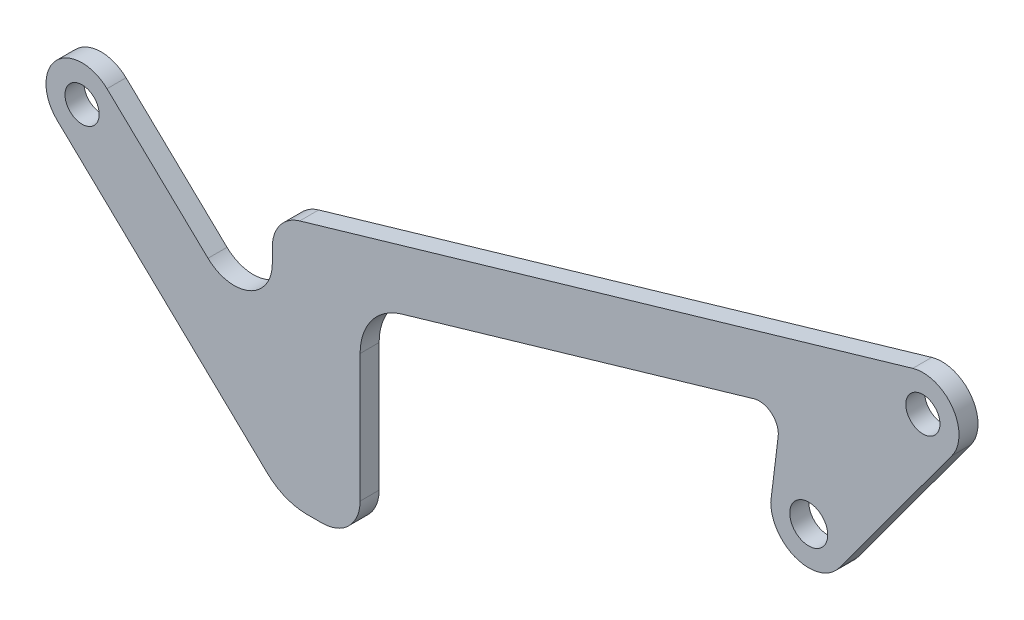
ISO-10303-21;
HEADER;
FILE_DESCRIPTION(('STEP AP214'),'2;1');
FILE_NAME('part.step','',(''),(''),'','','');
FILE_SCHEMA(('AUTOMOTIVE_DESIGN { 1 0 10303 214 1 1 1 1 }'));
ENDSEC;
DATA;
#1=APPLICATION_CONTEXT('core data for automotive mechanical design processes');
#2=APPLICATION_PROTOCOL_DEFINITION('international standard','automotive_design',2000,#1);
#3=PRODUCT_CONTEXT('',#1,'mechanical');
#4=PRODUCT('Part','Part','',(#3));
#5=PRODUCT_RELATED_PRODUCT_CATEGORY('part','',(#4));
#6=PRODUCT_DEFINITION_FORMATION('','',#4);
#7=PRODUCT_DEFINITION_CONTEXT('part definition',#1,'design');
#8=PRODUCT_DEFINITION('design','',#6,#7);
#9=PRODUCT_DEFINITION_SHAPE('','',#8);
#10=(LENGTH_UNIT() NAMED_UNIT(*) SI_UNIT(.MILLI.,.METRE.));
#11=(NAMED_UNIT(*) PLANE_ANGLE_UNIT() SI_UNIT($,.RADIAN.));
#12=(NAMED_UNIT(*) SI_UNIT($,.STERADIAN.) SOLID_ANGLE_UNIT());
#13=UNCERTAINTY_MEASURE_WITH_UNIT(LENGTH_MEASURE(1.E-05),#10,'distance_accuracy_value','');
#14=(GEOMETRIC_REPRESENTATION_CONTEXT(3) GLOBAL_UNCERTAINTY_ASSIGNED_CONTEXT((#13)) GLOBAL_UNIT_ASSIGNED_CONTEXT((#10,
#11,#12)) REPRESENTATION_CONTEXT('',''));
#15=CARTESIAN_POINT('',(0.,0.,0.));
#16=DIRECTION('',(0.,0.,1.));
#17=DIRECTION('',(1.,0.,0.));
#18=AXIS2_PLACEMENT_3D('',#15,#16,#17);
#19=CARTESIAN_POINT('',(-151.,-11.2228576199505,5.));
#20=DIRECTION('',(0.,0.,-1.));
#21=DIRECTION('',(-1.,0.,0.));
#22=AXIS2_PLACEMENT_3D('',#19,#20,#21);
#23=PLANE('',#22);
#24=CARTESIAN_POINT('',(-151.,-11.2228576199505,5.));
#25=DIRECTION('',(0.,0.,-1.));
#26=DIRECTION('',(-1.,0.,0.));
#27=AXIS2_PLACEMENT_3D('',#24,#25,#26);
#28=CIRCLE('',#27,10.);
#29=CARTESIAN_POINT('',(-141.,-11.2228576199505,5.));
#30=VERTEX_POINT('',#29);
#31=CARTESIAN_POINT('',(-157.902605290482,-18.4584667998199,5.));
#32=VERTEX_POINT('',#31);
#33=EDGE_CURVE('E254',#30,#32,#28,.T.);
#34=ORIENTED_EDGE('',*,*,#33,.T.);
#35=DIRECTION('',(-0.723560917986935,0.690260529048202,0.));
#36=VECTOR('',#35,1.);
#37=CARTESIAN_POINT('',(-184.449427579333,6.86659311169602,5.));
#38=LINE('',#37,#36);
#39=CARTESIAN_POINT('',(-184.449427579333,6.86659311169602,5.));
#40=VERTEX_POINT('',#39);
#41=EDGE_CURVE('E130',#32,#40,#38,.T.);
#42=ORIENTED_EDGE('',*,*,#41,.T.);
#43=CARTESIAN_POINT('',(-191.,0.,5.));
#44=DIRECTION('',(0.,0.,1.));
#45=DIRECTION('',(1.,0.,0.));
#46=AXIS2_PLACEMENT_3D('',#43,#44,#45);
#47=CIRCLE('',#46,9.48999999999999);
#48=CARTESIAN_POINT('',(-197.550572420667,-6.86659311169601,5.));
#49=VERTEX_POINT('',#48);
#50=EDGE_CURVE('E315',#40,#49,#47,.T.);
#51=ORIENTED_EDGE('',*,*,#50,.T.);
#52=DIRECTION('',(0.723560917986936,-0.690260529048201,0.));
#53=VECTOR('',#52,1.);
#54=CARTESIAN_POINT('',(-197.550572420667,-6.86659311169601,5.));
#55=LINE('',#54,#53);
#56=CARTESIAN_POINT('',(-142.270365562473,-59.6026432261669,5.));
#57=VERTEX_POINT('',#56);
#58=EDGE_CURVE('E335',#49,#57,#55,.T.);
#59=ORIENTED_EDGE('',*,*,#58,.T.);
#60=CARTESIAN_POINT('',(-131.916457626749,-48.7492294563629,5.));
#61=DIRECTION('',(0.,0.,1.));
#62=DIRECTION('',(-1.,0.,0.));
#63=AXIS2_PLACEMENT_3D('',#60,#61,#62);
#64=CIRCLE('',#63,15.);
#65=CARTESIAN_POINT('',(-131.916457626749,-63.7492294563629,5.));
#66=VERTEX_POINT('',#65);
#67=EDGE_CURVE('E331',#57,#66,#64,.T.);
#68=ORIENTED_EDGE('',*,*,#67,.T.);
#69=DIRECTION('',(1.,0.,0.));
#70=VECTOR('',#69,1.);
#71=CARTESIAN_POINT('',(-127.923734670265,-63.7492294563629,5.));
#72=LINE('',#71,#70);
#73=CARTESIAN_POINT('',(-127.923734670265,-63.7492294563629,5.));
#74=VERTEX_POINT('',#73);
#75=EDGE_CURVE('E334',#66,#74,#72,.T.);
#76=ORIENTED_EDGE('',*,*,#75,.T.);
#77=CARTESIAN_POINT('',(-127.923734670265,-53.7492294563629,5.));
#78=DIRECTION('',(0.,0.,1.));
#79=DIRECTION('',(1.,0.,0.));
#80=AXIS2_PLACEMENT_3D('',#77,#78,#79);
#81=CIRCLE('',#80,9.99999999999999);
#82=CARTESIAN_POINT('',(-117.923734670265,-53.7492294563629,5.));
#83=VERTEX_POINT('',#82);
#84=EDGE_CURVE('E339',#74,#83,#81,.T.);
#85=ORIENTED_EDGE('',*,*,#84,.T.);
#86=DIRECTION('',(0.,1.,0.));
#87=VECTOR('',#86,1.);
#88=CARTESIAN_POINT('',(-117.923734670265,-20.1425863608508,5.));
#89=LINE('',#88,#87);
#90=CARTESIAN_POINT('',(-117.923734670265,-20.1425863608508,5.));
#91=VERTEX_POINT('',#90);
#92=EDGE_CURVE('E346',#83,#91,#89,.T.);
#93=ORIENTED_EDGE('',*,*,#92,.T.);
#94=CARTESIAN_POINT('',(-102.923734670265,-20.1425863608507,5.));
#95=DIRECTION('',(0.,0.,-1.));
#96=DIRECTION('',(-1.,0.,0.));
#97=AXIS2_PLACEMENT_3D('',#94,#95,#96);
#98=CIRCLE('',#97,15.);
#99=CARTESIAN_POINT('',(-107.124555832585,-5.74282589193305,5.));
#100=VERTEX_POINT('',#99);
#101=EDGE_CURVE('E349',#91,#100,#98,.T.);
#102=ORIENTED_EDGE('',*,*,#101,.T.);
#103=DIRECTION('',(0.95998403126118,0.280054744154662,0.));
#104=VECTOR('',#103,1.);
#105=CARTESIAN_POINT('',(-107.124555832585,-5.74282589193305,5.));
#106=LINE('',#105,#104);
#107=CARTESIAN_POINT('',(-14.3979783231367,21.308163598621,5.));
#108=VERTEX_POINT('',#107);
#109=EDGE_CURVE('E352',#100,#108,#106,.T.);
#110=ORIENTED_EDGE('',*,*,#109,.T.);
#111=CARTESIAN_POINT('',(-12.9977046023634,16.5082434423151,5.));
#112=DIRECTION('',(0.,0.,-1.));
#113=DIRECTION('',(1.,0.,0.));
#114=AXIS2_PLACEMENT_3D('',#111,#112,#113);
#115=CIRCLE('',#114,5.);
#116=CARTESIAN_POINT('',(-8.03508293290737,15.8980089252273,5.));
#117=VERTEX_POINT('',#116);
#118=EDGE_CURVE('E355',#108,#117,#115,.T.);
#119=ORIENTED_EDGE('',*,*,#118,.T.);
#120=DIRECTION('',(-0.122046903417556,-0.992524333891208,0.));
#121=VECTOR('',#120,1.);
#122=CARTESIAN_POINT('',(-8.03508293290737,15.8980089252273,5.));
#123=LINE('',#122,#121);
#124=CARTESIAN_POINT('',(-9.99,0.,5.));
#125=VERTEX_POINT('',#124);
#126=EDGE_CURVE('E358',#117,#125,#123,.T.);
#127=ORIENTED_EDGE('',*,*,#126,.T.);
#128=CARTESIAN_POINT('',(0.,0.,5.));
#129=DIRECTION('',(0.,0.,1.));
#130=DIRECTION('',(1.,0.,0.));
#131=AXIS2_PLACEMENT_3D('',#128,#129,#130);
#132=CIRCLE('',#131,9.99);
#133=CARTESIAN_POINT('',(8.0515403900095,-5.91378029250713,5.));
#134=VERTEX_POINT('',#133);
#135=EDGE_CURVE('E361',#125,#134,#132,.T.);
#136=ORIENTED_EDGE('',*,*,#135,.T.);
#137=DIRECTION('',(0.591969999249963,0.80595999899995,0.));
#138=VECTOR('',#137,1.);
#139=CARTESIAN_POINT('',(37.6485603905095,34.3822047071179,5.));
#140=LINE('',#139,#138);
#141=CARTESIAN_POINT('',(37.6485603905095,34.3822047071179,5.));
#142=VERTEX_POINT('',#141);
#143=EDGE_CURVE('E364',#134,#142,#140,.T.);
#144=ORIENTED_EDGE('',*,*,#143,.T.);
#145=CARTESIAN_POINT('',(30.,40.,5.));
#146=DIRECTION('',(0.,0.,1.));
#147=DIRECTION('',(1.,0.,0.));
#148=AXIS2_PLACEMENT_3D('',#145,#146,#147);
#149=CIRCLE('',#148,9.49000000000001);
#150=CARTESIAN_POINT('',(27.3422804779723,49.1102484566686,5.));
#151=VERTEX_POINT('',#150);
#152=EDGE_CURVE('E179',#142,#151,#149,.T.);
#153=ORIENTED_EDGE('',*,*,#152,.T.);
#154=DIRECTION('',(-0.95998403126118,-0.280054744154662,0.));
#155=VECTOR('',#154,1.);
#156=CARTESIAN_POINT('',(-133.800547441547,2.1002858158614,5.));
#157=LINE('',#156,#155);
#158=CARTESIAN_POINT('',(-133.800547441547,2.1002858158614,5.));
#159=VERTEX_POINT('',#158);
#160=EDGE_CURVE('E173',#151,#159,#157,.T.);
#161=ORIENTED_EDGE('',*,*,#160,.T.);
#162=CARTESIAN_POINT('',(-131.,-7.49955449675042,5.));
#163=DIRECTION('',(0.,0.,1.));
#164=DIRECTION('',(1.,0.,0.));
#165=AXIS2_PLACEMENT_3D('',#162,#163,#164);
#166=CIRCLE('',#165,10.);
#167=CARTESIAN_POINT('',(-141.,-7.49955449675047,5.));
#168=VERTEX_POINT('',#167);
#169=EDGE_CURVE('E177',#159,#168,#166,.T.);
#170=ORIENTED_EDGE('',*,*,#169,.T.);
#171=DIRECTION('',(0.,-1.,0.));
#172=VECTOR('',#171,1.);
#173=CARTESIAN_POINT('',(-141.,-7.49955449675047,5.));
#174=LINE('',#173,#172);
#175=EDGE_CURVE('E57',#168,#30,#174,.T.);
#176=ORIENTED_EDGE('',*,*,#175,.T.);
#177=EDGE_LOOP('',(#34,#42,#51,#59,#68,#76,#85,#93,#102,#110,#119,#127,#136,#144,#153,#161,#170,#176));
#178=FACE_BOUND('',#177,.T.);
#179=CARTESIAN_POINT('',(0.,0.,5.));
#180=DIRECTION('',(0.,0.,1.));
#181=DIRECTION('',(1.,0.,0.));
#182=AXIS2_PLACEMENT_3D('',#179,#180,#181);
#183=CIRCLE('',#182,4.99);
#184=CARTESIAN_POINT('',(4.99,0.,5.));
#185=VERTEX_POINT('',#184);
#186=EDGE_CURVE('E206',#185,#185,#183,.T.);
#187=ORIENTED_EDGE('',*,*,#186,.F.);
#188=EDGE_LOOP('',(#187));
#189=FACE_BOUND('',#188,.T.);
#190=CARTESIAN_POINT('',(-191.,0.,5.));
#191=DIRECTION('',(0.,0.,1.));
#192=DIRECTION('',(1.,0.,0.));
#193=AXIS2_PLACEMENT_3D('',#190,#191,#192);
#194=CIRCLE('',#193,4.48999999999998);
#195=CARTESIAN_POINT('',(-186.51,0.,5.));
#196=VERTEX_POINT('',#195);
#197=EDGE_CURVE('E422',#196,#196,#194,.T.);
#198=ORIENTED_EDGE('',*,*,#197,.F.);
#199=EDGE_LOOP('',(#198));
#200=FACE_BOUND('',#199,.T.);
#201=CARTESIAN_POINT('',(30.,40.,5.));
#202=DIRECTION('',(0.,0.,1.));
#203=DIRECTION('',(1.,0.,0.));
#204=AXIS2_PLACEMENT_3D('',#201,#202,#203);
#205=CIRCLE('',#204,4.49);
#206=CARTESIAN_POINT('',(34.49,40.,5.));
#207=VERTEX_POINT('',#206);
#208=EDGE_CURVE('E411',#207,#207,#205,.T.);
#209=ORIENTED_EDGE('',*,*,#208,.F.);
#210=EDGE_LOOP('',(#209));
#211=FACE_BOUND('',#210,.T.);
#212=ADVANCED_FACE('F39',(#178,#189,#200,#211),#23,.F.);
#213=CARTESIAN_POINT('',(-151.,-11.2228576199505,0.));
#214=DIRECTION('',(0.,0.,-1.));
#215=DIRECTION('',(-1.,0.,0.));
#216=AXIS2_PLACEMENT_3D('',#213,#214,#215);
#217=PLANE('',#216);
#218=CARTESIAN_POINT('',(-191.,0.,0.));
#219=DIRECTION('',(0.,0.,1.));
#220=DIRECTION('',(1.,0.,0.));
#221=AXIS2_PLACEMENT_3D('',#218,#219,#220);
#222=CIRCLE('',#221,4.48999999999998);
#223=CARTESIAN_POINT('',(-186.51,0.,0.));
#224=VERTEX_POINT('',#223);
#225=EDGE_CURVE('E419',#224,#224,#222,.T.);
#226=ORIENTED_EDGE('',*,*,#225,.T.);
#227=EDGE_LOOP('',(#226));
#228=FACE_BOUND('',#227,.T.);
#229=CARTESIAN_POINT('',(-151.,-11.2228576199505,0.));
#230=DIRECTION('',(0.,0.,-1.));
#231=DIRECTION('',(-1.,0.,0.));
#232=AXIS2_PLACEMENT_3D('',#229,#230,#231);
#233=CIRCLE('',#232,10.);
#234=CARTESIAN_POINT('',(-141.,-11.2228576199505,0.));
#235=VERTEX_POINT('',#234);
#236=CARTESIAN_POINT('',(-157.902605290482,-18.4584667998199,0.));
#237=VERTEX_POINT('',#236);
#238=EDGE_CURVE('E201',#235,#237,#233,.T.);
#239=ORIENTED_EDGE('',*,*,#238,.F.);
#240=DIRECTION('',(0.,-1.,0.));
#241=VECTOR('',#240,1.);
#242=CARTESIAN_POINT('',(-141.,-7.49955449675047,0.));
#243=LINE('',#242,#241);
#244=CARTESIAN_POINT('',(-141.,-7.49955449675047,0.));
#245=VERTEX_POINT('',#244);
#246=EDGE_CURVE('E122',#245,#235,#243,.T.);
#247=ORIENTED_EDGE('',*,*,#246,.F.);
#248=CARTESIAN_POINT('',(-131.,-7.49955449675042,0.));
#249=DIRECTION('',(0.,0.,1.));
#250=DIRECTION('',(1.,0.,0.));
#251=AXIS2_PLACEMENT_3D('',#248,#249,#250);
#252=CIRCLE('',#251,10.);
#253=CARTESIAN_POINT('',(-133.800547441547,2.1002858158614,0.));
#254=VERTEX_POINT('',#253);
#255=EDGE_CURVE('E116',#254,#245,#252,.T.);
#256=ORIENTED_EDGE('',*,*,#255,.F.);
#257=DIRECTION('',(-0.95998403126118,-0.280054744154662,0.));
#258=VECTOR('',#257,1.);
#259=CARTESIAN_POINT('',(-133.800547441547,2.1002858158614,0.));
#260=LINE('',#259,#258);
#261=CARTESIAN_POINT('',(27.3422804779723,49.1102484566686,0.));
#262=VERTEX_POINT('',#261);
#263=EDGE_CURVE('E188',#262,#254,#260,.T.);
#264=ORIENTED_EDGE('',*,*,#263,.F.);
#265=CARTESIAN_POINT('',(30.,40.,0.));
#266=DIRECTION('',(0.,0.,1.));
#267=DIRECTION('',(1.,0.,0.));
#268=AXIS2_PLACEMENT_3D('',#265,#266,#267);
#269=CIRCLE('',#268,9.49000000000001);
#270=CARTESIAN_POINT('',(37.6485603905095,34.3822047071179,0.));
#271=VERTEX_POINT('',#270);
#272=EDGE_CURVE('E245',#271,#262,#269,.T.);
#273=ORIENTED_EDGE('',*,*,#272,.F.);
#274=DIRECTION('',(0.591969999249963,0.80595999899995,0.));
#275=VECTOR('',#274,1.);
#276=CARTESIAN_POINT('',(37.6485603905095,34.3822047071179,0.));
#277=LINE('',#276,#275);
#278=CARTESIAN_POINT('',(8.0515403900095,-5.91378029250713,0.));
#279=VERTEX_POINT('',#278);
#280=EDGE_CURVE('E242',#279,#271,#277,.T.);
#281=ORIENTED_EDGE('',*,*,#280,.F.);
#282=CARTESIAN_POINT('',(0.,0.,0.));
#283=DIRECTION('',(0.,0.,1.));
#284=DIRECTION('',(1.,0.,0.));
#285=AXIS2_PLACEMENT_3D('',#282,#283,#284);
#286=CIRCLE('',#285,9.99);
#287=CARTESIAN_POINT('',(-9.99,0.,0.));
#288=VERTEX_POINT('',#287);
#289=EDGE_CURVE('E239',#288,#279,#286,.T.);
#290=ORIENTED_EDGE('',*,*,#289,.F.);
#291=DIRECTION('',(-0.122046903417556,-0.992524333891208,0.));
#292=VECTOR('',#291,1.);
#293=CARTESIAN_POINT('',(-8.03508293290737,15.8980089252273,0.));
#294=LINE('',#293,#292);
#295=CARTESIAN_POINT('',(-8.03508293290737,15.8980089252273,0.));
#296=VERTEX_POINT('',#295);
#297=EDGE_CURVE('E236',#296,#288,#294,.T.);
#298=ORIENTED_EDGE('',*,*,#297,.F.);
#299=CARTESIAN_POINT('',(-12.9977046023634,16.5082434423151,0.));
#300=DIRECTION('',(0.,0.,-1.));
#301=DIRECTION('',(1.,0.,0.));
#302=AXIS2_PLACEMENT_3D('',#299,#300,#301);
#303=CIRCLE('',#302,5.);
#304=CARTESIAN_POINT('',(-14.3979783231367,21.308163598621,0.));
#305=VERTEX_POINT('',#304);
#306=EDGE_CURVE('E233',#305,#296,#303,.T.);
#307=ORIENTED_EDGE('',*,*,#306,.F.);
#308=DIRECTION('',(0.95998403126118,0.280054744154662,0.));
#309=VECTOR('',#308,1.);
#310=CARTESIAN_POINT('',(-107.124555832585,-5.74282589193305,0.));
#311=LINE('',#310,#309);
#312=CARTESIAN_POINT('',(-107.124555832585,-5.74282589193305,0.));
#313=VERTEX_POINT('',#312);
#314=EDGE_CURVE('E230',#313,#305,#311,.T.);
#315=ORIENTED_EDGE('',*,*,#314,.F.);
#316=CARTESIAN_POINT('',(-102.923734670265,-20.1425863608507,0.));
#317=DIRECTION('',(0.,0.,-1.));
#318=DIRECTION('',(-1.,0.,0.));
#319=AXIS2_PLACEMENT_3D('',#316,#317,#318);
#320=CIRCLE('',#319,15.);
#321=CARTESIAN_POINT('',(-117.923734670265,-20.1425863608508,0.));
#322=VERTEX_POINT('',#321);
#323=EDGE_CURVE('E227',#322,#313,#320,.T.);
#324=ORIENTED_EDGE('',*,*,#323,.F.);
#325=DIRECTION('',(0.,1.,0.));
#326=VECTOR('',#325,1.);
#327=CARTESIAN_POINT('',(-117.923734670265,-20.1425863608508,0.));
#328=LINE('',#327,#326);
#329=CARTESIAN_POINT('',(-117.923734670265,-53.7492294563629,0.));
#330=VERTEX_POINT('',#329);
#331=EDGE_CURVE('E224',#330,#322,#328,.T.);
#332=ORIENTED_EDGE('',*,*,#331,.F.);
#333=CARTESIAN_POINT('',(-127.923734670265,-53.7492294563629,0.));
#334=DIRECTION('',(0.,0.,1.));
#335=DIRECTION('',(1.,0.,0.));
#336=AXIS2_PLACEMENT_3D('',#333,#334,#335);
#337=CIRCLE('',#336,9.99999999999999);
#338=CARTESIAN_POINT('',(-127.923734670265,-63.7492294563629,0.));
#339=VERTEX_POINT('',#338);
#340=EDGE_CURVE('E221',#339,#330,#337,.T.);
#341=ORIENTED_EDGE('',*,*,#340,.F.);
#342=DIRECTION('',(1.,0.,0.));
#343=VECTOR('',#342,1.);
#344=CARTESIAN_POINT('',(-127.923734670265,-63.7492294563629,0.));
#345=LINE('',#344,#343);
#346=CARTESIAN_POINT('',(-131.916457626749,-63.7492294563629,0.));
#347=VERTEX_POINT('',#346);
#348=EDGE_CURVE('E218',#347,#339,#345,.T.);
#349=ORIENTED_EDGE('',*,*,#348,.F.);
#350=CARTESIAN_POINT('',(-131.916457626749,-48.7492294563629,0.));
#351=DIRECTION('',(0.,0.,1.));
#352=DIRECTION('',(-1.,0.,0.));
#353=AXIS2_PLACEMENT_3D('',#350,#351,#352);
#354=CIRCLE('',#353,15.);
#355=CARTESIAN_POINT('',(-142.270365562473,-59.6026432261669,0.));
#356=VERTEX_POINT('',#355);
#357=EDGE_CURVE('E215',#356,#347,#354,.T.);
#358=ORIENTED_EDGE('',*,*,#357,.F.);
#359=DIRECTION('',(0.723560917986936,-0.690260529048201,0.));
#360=VECTOR('',#359,1.);
#361=CARTESIAN_POINT('',(-197.550572420667,-6.86659311169601,0.));
#362=LINE('',#361,#360);
#363=CARTESIAN_POINT('',(-197.550572420667,-6.86659311169601,0.));
#364=VERTEX_POINT('',#363);
#365=EDGE_CURVE('E212',#364,#356,#362,.T.);
#366=ORIENTED_EDGE('',*,*,#365,.F.);
#367=CARTESIAN_POINT('',(-191.,0.,0.));
#368=DIRECTION('',(0.,0.,1.));
#369=DIRECTION('',(1.,0.,0.));
#370=AXIS2_PLACEMENT_3D('',#367,#368,#369);
#371=CIRCLE('',#370,9.48999999999999);
#372=CARTESIAN_POINT('',(-184.449427579333,6.86659311169602,0.));
#373=VERTEX_POINT('',#372);
#374=EDGE_CURVE('E209',#373,#364,#371,.T.);
#375=ORIENTED_EDGE('',*,*,#374,.F.);
#376=DIRECTION('',(-0.723560917986935,0.690260529048202,0.));
#377=VECTOR('',#376,1.);
#378=CARTESIAN_POINT('',(-184.449427579333,6.86659311169602,0.));
#379=LINE('',#378,#377);
#380=EDGE_CURVE('E205',#237,#373,#379,.T.);
#381=ORIENTED_EDGE('',*,*,#380,.F.);
#382=EDGE_LOOP('',(#239,#247,#256,#264,#273,#281,#290,#298,#307,#315,#324,#332,#341,#349,#358,
#366,#375,#381));
#383=FACE_BOUND('',#382,.T.);
#384=CARTESIAN_POINT('',(0.,0.,0.));
#385=DIRECTION('',(0.,0.,1.));
#386=DIRECTION('',(1.,0.,0.));
#387=AXIS2_PLACEMENT_3D('',#384,#385,#386);
#388=CIRCLE('',#387,4.99);
#389=CARTESIAN_POINT('',(4.99,0.,0.));
#390=VERTEX_POINT('',#389);
#391=EDGE_CURVE('E426',#390,#390,#388,.T.);
#392=ORIENTED_EDGE('',*,*,#391,.T.);
#393=EDGE_LOOP('',(#392));
#394=FACE_BOUND('',#393,.T.);
#395=CARTESIAN_POINT('',(30.,40.,0.));
#396=DIRECTION('',(0.,0.,1.));
#397=DIRECTION('',(1.,0.,0.));
#398=AXIS2_PLACEMENT_3D('',#395,#396,#397);
#399=CIRCLE('',#398,4.49);
#400=CARTESIAN_POINT('',(34.49,40.,0.));
#401=VERTEX_POINT('',#400);
#402=EDGE_CURVE('E414',#401,#401,#399,.T.);
#403=ORIENTED_EDGE('',*,*,#402,.T.);
#404=EDGE_LOOP('',(#403));
#405=FACE_BOUND('',#404,.T.);
#406=ADVANCED_FACE('F319',(#228,#383,#394,#405),#217,.T.);
#407=CARTESIAN_POINT('',(-151.,-11.2228576199505,5.));
#408=DIRECTION('',(0.,0.,-1.));
#409=DIRECTION('',(-1.,0.,0.));
#410=AXIS2_PLACEMENT_3D('',#407,#408,#409);
#411=CYLINDRICAL_SURFACE('',#410,10.);
#412=ORIENTED_EDGE('',*,*,#238,.T.);
#413=DIRECTION('',(0.,0.,-1.));
#414=VECTOR('',#413,1.);
#415=CARTESIAN_POINT('',(-157.902605290482,-18.4584667998199,5.));
#416=LINE('',#415,#414);
#417=EDGE_CURVE('E11',#32,#237,#416,.T.);
#418=ORIENTED_EDGE('',*,*,#417,.F.);
#419=ORIENTED_EDGE('',*,*,#33,.F.);
#420=DIRECTION('',(0.,0.,-1.));
#421=VECTOR('',#420,1.);
#422=CARTESIAN_POINT('',(-141.,-11.2228576199505,5.));
#423=LINE('',#422,#421);
#424=EDGE_CURVE('E197',#30,#235,#423,.T.);
#425=ORIENTED_EDGE('',*,*,#424,.T.);
#426=EDGE_LOOP('',(#412,#418,#419,#425));
#427=FACE_BOUND('',#426,.T.);
#428=ADVANCED_FACE('F41',(#427),#411,.F.);
#429=CARTESIAN_POINT('',(-184.449427579333,6.86659311169602,5.));
#430=DIRECTION('',(-0.690260529048202,-0.723560917986935,0.));
#431=DIRECTION('',(0.723560917986935,-0.690260529048202,0.));
#432=AXIS2_PLACEMENT_3D('',#429,#430,#431);
#433=PLANE('',#432);
#434=ORIENTED_EDGE('',*,*,#380,.T.);
#435=DIRECTION('',(0.,0.,-1.));
#436=VECTOR('',#435,1.);
#437=CARTESIAN_POINT('',(-184.449427579333,6.86659311169602,5.));
#438=LINE('',#437,#436);
#439=EDGE_CURVE('E49',#40,#373,#438,.T.);
#440=ORIENTED_EDGE('',*,*,#439,.F.);
#441=ORIENTED_EDGE('',*,*,#41,.F.);
#442=ORIENTED_EDGE('',*,*,#417,.T.);
#443=EDGE_LOOP('',(#434,#440,#441,#442));
#444=FACE_BOUND('',#443,.T.);
#445=ADVANCED_FACE('F595',(#444),#433,.F.);
#446=CARTESIAN_POINT('',(-191.,0.,5.));
#447=DIRECTION('',(0.,0.,-1.));
#448=DIRECTION('',(-1.,0.,0.));
#449=AXIS2_PLACEMENT_3D('',#446,#447,#448);
#450=CYLINDRICAL_SURFACE('',#449,9.48999999999999);
#451=ORIENTED_EDGE('',*,*,#374,.T.);
#452=DIRECTION('',(0.,0.,-1.));
#453=VECTOR('',#452,1.);
#454=CARTESIAN_POINT('',(-197.550572420667,-6.86659311169601,5.));
#455=LINE('',#454,#453);
#456=EDGE_CURVE('E305',#49,#364,#455,.T.);
#457=ORIENTED_EDGE('',*,*,#456,.F.);
#458=ORIENTED_EDGE('',*,*,#50,.F.);
#459=ORIENTED_EDGE('',*,*,#439,.T.);
#460=EDGE_LOOP('',(#451,#457,#458,#459));
#461=FACE_BOUND('',#460,.T.);
#462=ADVANCED_FACE('F313',(#461),#450,.T.);
#463=CARTESIAN_POINT('',(-197.550572420667,-6.86659311169601,5.));
#464=DIRECTION('',(0.690260529048201,0.723560917986936,0.));
#465=DIRECTION('',(-0.723560917986936,0.690260529048201,0.));
#466=AXIS2_PLACEMENT_3D('',#463,#464,#465);
#467=PLANE('',#466);
#468=ORIENTED_EDGE('',*,*,#365,.T.);
#469=DIRECTION('',(0.,0.,-1.));
#470=VECTOR('',#469,1.);
#471=CARTESIAN_POINT('',(-142.270365562473,-59.6026432261669,5.));
#472=LINE('',#471,#470);
#473=EDGE_CURVE('E301',#57,#356,#472,.T.);
#474=ORIENTED_EDGE('',*,*,#473,.F.);
#475=ORIENTED_EDGE('',*,*,#58,.F.);
#476=ORIENTED_EDGE('',*,*,#456,.T.);
#477=EDGE_LOOP('',(#468,#474,#475,#476));
#478=FACE_BOUND('',#477,.T.);
#479=ADVANCED_FACE('F325',(#478),#467,.F.);
#480=CARTESIAN_POINT('',(-131.916457626749,-48.7492294563629,5.));
#481=DIRECTION('',(0.,0.,-1.));
#482=DIRECTION('',(-1.,0.,0.));
#483=AXIS2_PLACEMENT_3D('',#480,#481,#482);
#484=CYLINDRICAL_SURFACE('',#483,15.);
#485=ORIENTED_EDGE('',*,*,#357,.T.);
#486=DIRECTION('',(0.,0.,-1.));
#487=VECTOR('',#486,1.);
#488=CARTESIAN_POINT('',(-131.916457626749,-63.7492294563629,5.));
#489=LINE('',#488,#487);
#490=EDGE_CURVE('E297',#66,#347,#489,.T.);
#491=ORIENTED_EDGE('',*,*,#490,.F.);
#492=ORIENTED_EDGE('',*,*,#67,.F.);
#493=ORIENTED_EDGE('',*,*,#473,.T.);
#494=EDGE_LOOP('',(#485,#491,#492,#493));
#495=FACE_BOUND('',#494,.T.);
#496=ADVANCED_FACE('F329',(#495),#484,.T.);
#497=CARTESIAN_POINT('',(-127.923734670265,-63.7492294563629,5.));
#498=DIRECTION('',(0.,1.,0.));
#499=DIRECTION('',(-1.,0.,0.));
#500=AXIS2_PLACEMENT_3D('',#497,#498,#499);
#501=PLANE('',#500);
#502=ORIENTED_EDGE('',*,*,#348,.T.);
#503=DIRECTION('',(0.,0.,-1.));
#504=VECTOR('',#503,1.);
#505=CARTESIAN_POINT('',(-127.923734670265,-63.7492294563629,5.));
#506=LINE('',#505,#504);
#507=EDGE_CURVE('E293',#74,#339,#506,.T.);
#508=ORIENTED_EDGE('',*,*,#507,.F.);
#509=ORIENTED_EDGE('',*,*,#75,.F.);
#510=ORIENTED_EDGE('',*,*,#490,.T.);
#511=EDGE_LOOP('',(#502,#508,#509,#510));
#512=FACE_BOUND('',#511,.T.);
#513=ADVANCED_FACE('F560',(#512),#501,.F.);
#514=CARTESIAN_POINT('',(-127.923734670265,-53.7492294563629,5.));
#515=DIRECTION('',(0.,0.,-1.));
#516=DIRECTION('',(-1.,0.,0.));
#517=AXIS2_PLACEMENT_3D('',#514,#515,#516);
#518=CYLINDRICAL_SURFACE('',#517,9.99999999999999);
#519=ORIENTED_EDGE('',*,*,#340,.T.);
#520=DIRECTION('',(0.,0.,-1.));
#521=VECTOR('',#520,1.);
#522=CARTESIAN_POINT('',(-117.923734670265,-53.7492294563629,5.));
#523=LINE('',#522,#521);
#524=EDGE_CURVE('E289',#83,#330,#523,.T.);
#525=ORIENTED_EDGE('',*,*,#524,.F.);
#526=ORIENTED_EDGE('',*,*,#84,.F.);
#527=ORIENTED_EDGE('',*,*,#507,.T.);
#528=EDGE_LOOP('',(#519,#525,#526,#527));
#529=FACE_BOUND('',#528,.T.);
#530=ADVANCED_FACE('F550',(#529),#518,.T.);
#531=CARTESIAN_POINT('',(-117.923734670265,-20.1425863608508,5.));
#532=DIRECTION('',(-1.,0.,0.));
#533=DIRECTION('',(0.,-1.,0.));
#534=AXIS2_PLACEMENT_3D('',#531,#532,#533);
#535=PLANE('',#534);
#536=ORIENTED_EDGE('',*,*,#331,.T.);
#537=DIRECTION('',(0.,0.,-1.));
#538=VECTOR('',#537,1.);
#539=CARTESIAN_POINT('',(-117.923734670265,-20.1425863608508,5.));
#540=LINE('',#539,#538);
#541=EDGE_CURVE('E285',#91,#322,#540,.T.);
#542=ORIENTED_EDGE('',*,*,#541,.F.);
#543=ORIENTED_EDGE('',*,*,#92,.F.);
#544=ORIENTED_EDGE('',*,*,#524,.T.);
#545=EDGE_LOOP('',(#536,#542,#543,#544));
#546=FACE_BOUND('',#545,.T.);
#547=ADVANCED_FACE('F540',(#546),#535,.F.);
#548=CARTESIAN_POINT('',(-102.923734670265,-20.1425863608507,5.));
#549=DIRECTION('',(0.,0.,-1.));
#550=DIRECTION('',(-1.,0.,0.));
#551=AXIS2_PLACEMENT_3D('',#548,#549,#550);
#552=CYLINDRICAL_SURFACE('',#551,15.);
#553=ORIENTED_EDGE('',*,*,#323,.T.);
#554=DIRECTION('',(0.,0.,-1.));
#555=VECTOR('',#554,1.);
#556=CARTESIAN_POINT('',(-107.124555832585,-5.74282589193305,5.));
#557=LINE('',#556,#555);
#558=EDGE_CURVE('E281',#100,#313,#557,.T.);
#559=ORIENTED_EDGE('',*,*,#558,.F.);
#560=ORIENTED_EDGE('',*,*,#101,.F.);
#561=ORIENTED_EDGE('',*,*,#541,.T.);
#562=EDGE_LOOP('',(#553,#559,#560,#561));
#563=FACE_BOUND('',#562,.T.);
#564=ADVANCED_FACE('F530',(#563),#552,.F.);
#565=CARTESIAN_POINT('',(-107.124555832585,-5.74282589193305,5.));
#566=DIRECTION('',(-0.280054744154662,0.95998403126118,0.));
#567=DIRECTION('',(-0.95998403126118,-0.280054744154662,0.));
#568=AXIS2_PLACEMENT_3D('',#565,#566,#567);
#569=PLANE('',#568);
#570=ORIENTED_EDGE('',*,*,#314,.T.);
#571=DIRECTION('',(0.,0.,-1.));
#572=VECTOR('',#571,1.);
#573=CARTESIAN_POINT('',(-14.3979783231367,21.308163598621,5.));
#574=LINE('',#573,#572);
#575=EDGE_CURVE('E277',#108,#305,#574,.T.);
#576=ORIENTED_EDGE('',*,*,#575,.F.);
#577=ORIENTED_EDGE('',*,*,#109,.F.);
#578=ORIENTED_EDGE('',*,*,#558,.T.);
#579=EDGE_LOOP('',(#570,#576,#577,#578));
#580=FACE_BOUND('',#579,.T.);
#581=ADVANCED_FACE('F520',(#580),#569,.F.);
#582=CARTESIAN_POINT('',(-12.9977046023634,16.5082434423151,5.));
#583=DIRECTION('',(0.,0.,-1.));
#584=DIRECTION('',(-1.,0.,0.));
#585=AXIS2_PLACEMENT_3D('',#582,#583,#584);
#586=CYLINDRICAL_SURFACE('',#585,5.);
#587=ORIENTED_EDGE('',*,*,#306,.T.);
#588=DIRECTION('',(0.,0.,-1.));
#589=VECTOR('',#588,1.);
#590=CARTESIAN_POINT('',(-8.03508293290737,15.8980089252273,5.));
#591=LINE('',#590,#589);
#592=EDGE_CURVE('E273',#117,#296,#591,.T.);
#593=ORIENTED_EDGE('',*,*,#592,.F.);
#594=ORIENTED_EDGE('',*,*,#118,.F.);
#595=ORIENTED_EDGE('',*,*,#575,.T.);
#596=EDGE_LOOP('',(#587,#593,#594,#595));
#597=FACE_BOUND('',#596,.T.);
#598=ADVANCED_FACE('F510',(#597),#586,.F.);
#599=CARTESIAN_POINT('',(-8.03508293290737,15.8980089252273,5.));
#600=DIRECTION('',(0.992524333891208,-0.122046903417556,0.));
#601=DIRECTION('',(0.122046903417556,0.992524333891208,0.));
#602=AXIS2_PLACEMENT_3D('',#599,#600,#601);
#603=PLANE('',#602);
#604=ORIENTED_EDGE('',*,*,#297,.T.);
#605=DIRECTION('',(0.,0.,-1.));
#606=VECTOR('',#605,1.);
#607=CARTESIAN_POINT('',(-9.99,0.,5.));
#608=LINE('',#607,#606);
#609=EDGE_CURVE('E269',#125,#288,#608,.T.);
#610=ORIENTED_EDGE('',*,*,#609,.F.);
#611=ORIENTED_EDGE('',*,*,#126,.F.);
#612=ORIENTED_EDGE('',*,*,#592,.T.);
#613=EDGE_LOOP('',(#604,#610,#611,#612));
#614=FACE_BOUND('',#613,.T.);
#615=ADVANCED_FACE('F500',(#614),#603,.F.);
#616=CARTESIAN_POINT('',(0.,0.,5.));
#617=DIRECTION('',(0.,0.,-1.));
#618=DIRECTION('',(-1.,0.,0.));
#619=AXIS2_PLACEMENT_3D('',#616,#617,#618);
#620=CYLINDRICAL_SURFACE('',#619,9.99);
#621=ORIENTED_EDGE('',*,*,#289,.T.);
#622=DIRECTION('',(0.,0.,-1.));
#623=VECTOR('',#622,1.);
#624=CARTESIAN_POINT('',(8.0515403900095,-5.91378029250713,5.));
#625=LINE('',#624,#623);
#626=EDGE_CURVE('E265',#134,#279,#625,.T.);
#627=ORIENTED_EDGE('',*,*,#626,.F.);
#628=ORIENTED_EDGE('',*,*,#135,.F.);
#629=ORIENTED_EDGE('',*,*,#609,.T.);
#630=EDGE_LOOP('',(#621,#627,#628,#629));
#631=FACE_BOUND('',#630,.T.);
#632=ADVANCED_FACE('F491',(#631),#620,.T.);
#633=CARTESIAN_POINT('',(37.6485603905095,34.3822047071179,5.));
#634=DIRECTION('',(-0.80595999899995,0.591969999249963,0.));
#635=DIRECTION('',(-0.591969999249963,-0.80595999899995,0.));
#636=AXIS2_PLACEMENT_3D('',#633,#634,#635);
#637=PLANE('',#636);
#638=ORIENTED_EDGE('',*,*,#280,.T.);
#639=DIRECTION('',(0.,0.,-1.));
#640=VECTOR('',#639,1.);
#641=CARTESIAN_POINT('',(37.6485603905095,34.3822047071179,5.));
#642=LINE('',#641,#640);
#643=EDGE_CURVE('E261',#142,#271,#642,.T.);
#644=ORIENTED_EDGE('',*,*,#643,.F.);
#645=ORIENTED_EDGE('',*,*,#143,.F.);
#646=ORIENTED_EDGE('',*,*,#626,.T.);
#647=EDGE_LOOP('',(#638,#644,#645,#646));
#648=FACE_BOUND('',#647,.T.);
#649=ADVANCED_FACE('F372',(#648),#637,.F.);
#650=CARTESIAN_POINT('',(30.,40.,5.));
#651=DIRECTION('',(0.,0.,-1.));
#652=DIRECTION('',(-1.,0.,0.));
#653=AXIS2_PLACEMENT_3D('',#650,#651,#652);
#654=CYLINDRICAL_SURFACE('',#653,9.49000000000001);
#655=ORIENTED_EDGE('',*,*,#272,.T.);
#656=DIRECTION('',(0.,0.,-1.));
#657=VECTOR('',#656,1.);
#658=CARTESIAN_POINT('',(27.3422804779723,49.1102484566686,5.));
#659=LINE('',#658,#657);
#660=EDGE_CURVE('E190',#151,#262,#659,.T.);
#661=ORIENTED_EDGE('',*,*,#660,.F.);
#662=ORIENTED_EDGE('',*,*,#152,.F.);
#663=ORIENTED_EDGE('',*,*,#643,.T.);
#664=EDGE_LOOP('',(#655,#661,#662,#663));
#665=FACE_BOUND('',#664,.T.);
#666=ADVANCED_FACE('F376',(#665),#654,.T.);
#667=CARTESIAN_POINT('',(-133.800547441547,2.1002858158614,5.));
#668=DIRECTION('',(0.280054744154662,-0.95998403126118,0.));
#669=DIRECTION('',(0.95998403126118,0.280054744154662,0.));
#670=AXIS2_PLACEMENT_3D('',#667,#668,#669);
#671=PLANE('',#670);
#672=ORIENTED_EDGE('',*,*,#263,.T.);
#673=DIRECTION('',(0.,0.,-1.));
#674=VECTOR('',#673,1.);
#675=CARTESIAN_POINT('',(-133.800547441547,2.1002858158614,5.));
#676=LINE('',#675,#674);
#677=EDGE_CURVE('E185',#159,#254,#676,.T.);
#678=ORIENTED_EDGE('',*,*,#677,.F.);
#679=ORIENTED_EDGE('',*,*,#160,.F.);
#680=ORIENTED_EDGE('',*,*,#660,.T.);
#681=EDGE_LOOP('',(#672,#678,#679,#680));
#682=FACE_BOUND('',#681,.T.);
#683=ADVANCED_FACE('F186',(#682),#671,.F.);
#684=CARTESIAN_POINT('',(-131.,-7.49955449675042,5.));
#685=DIRECTION('',(0.,0.,-1.));
#686=DIRECTION('',(-1.,0.,0.));
#687=AXIS2_PLACEMENT_3D('',#684,#685,#686);
#688=CYLINDRICAL_SURFACE('',#687,10.);
#689=ORIENTED_EDGE('',*,*,#255,.T.);
#690=DIRECTION('',(0.,0.,-1.));
#691=VECTOR('',#690,1.);
#692=CARTESIAN_POINT('',(-141.,-7.49955449675047,5.));
#693=LINE('',#692,#691);
#694=EDGE_CURVE('E191',#168,#245,#693,.T.);
#695=ORIENTED_EDGE('',*,*,#694,.F.);
#696=ORIENTED_EDGE('',*,*,#169,.F.);
#697=ORIENTED_EDGE('',*,*,#677,.T.);
#698=EDGE_LOOP('',(#689,#695,#696,#697));
#699=FACE_BOUND('',#698,.T.);
#700=ADVANCED_FACE('F193',(#699),#688,.T.);
#701=CARTESIAN_POINT('',(-141.,-7.49955449675047,5.));
#702=DIRECTION('',(1.,0.,0.));
#703=DIRECTION('',(0.,0.,-1.));
#704=AXIS2_PLACEMENT_3D('',#701,#702,#703);
#705=PLANE('',#704);
#706=ORIENTED_EDGE('',*,*,#246,.T.);
#707=ORIENTED_EDGE('',*,*,#424,.F.);
#708=ORIENTED_EDGE('',*,*,#175,.F.);
#709=ORIENTED_EDGE('',*,*,#694,.T.);
#710=EDGE_LOOP('',(#706,#707,#708,#709));
#711=FACE_BOUND('',#710,.T.);
#712=ADVANCED_FACE('F380',(#711),#705,.F.);
#713=CARTESIAN_POINT('',(0.,0.,5.));
#714=DIRECTION('',(0.,0.,-1.));
#715=DIRECTION('',(-1.,0.,0.));
#716=AXIS2_PLACEMENT_3D('',#713,#714,#715);
#717=CYLINDRICAL_SURFACE('',#716,4.99);
#718=ORIENTED_EDGE('',*,*,#186,.T.);
#719=EDGE_LOOP('',(#718));
#720=FACE_BOUND('',#719,.T.);
#721=ORIENTED_EDGE('',*,*,#391,.F.);
#722=EDGE_LOOP('',(#721));
#723=FACE_BOUND('',#722,.T.);
#724=ADVANCED_FACE('F382',(#720,#723),#717,.F.);
#725=CARTESIAN_POINT('',(-191.,0.,5.));
#726=DIRECTION('',(0.,0.,-1.));
#727=DIRECTION('',(-1.,0.,0.));
#728=AXIS2_PLACEMENT_3D('',#725,#726,#727);
#729=CYLINDRICAL_SURFACE('',#728,4.48999999999998);
#730=ORIENTED_EDGE('',*,*,#197,.T.);
#731=EDGE_LOOP('',(#730));
#732=FACE_BOUND('',#731,.T.);
#733=ORIENTED_EDGE('',*,*,#225,.F.);
#734=EDGE_LOOP('',(#733));
#735=FACE_BOUND('',#734,.T.);
#736=ADVANCED_FACE('F388',(#732,#735),#729,.F.);
#737=CARTESIAN_POINT('',(30.,40.,5.));
#738=DIRECTION('',(0.,0.,-1.));
#739=DIRECTION('',(-1.,0.,0.));
#740=AXIS2_PLACEMENT_3D('',#737,#738,#739);
#741=CYLINDRICAL_SURFACE('',#740,4.49);
#742=ORIENTED_EDGE('',*,*,#208,.T.);
#743=EDGE_LOOP('',(#742));
#744=FACE_BOUND('',#743,.T.);
#745=ORIENTED_EDGE('',*,*,#402,.F.);
#746=EDGE_LOOP('',(#745));
#747=FACE_BOUND('',#746,.T.);
#748=ADVANCED_FACE('F402',(#744,#747),#741,.F.);
#749=CLOSED_SHELL('',(#212,#406,#428,#445,#462,#479,#496,#513,#530,#547,#564,#581,#598,#615,
#632,#649,#666,#683,#700,#712,#724,#736,#748));
#750=MANIFOLD_SOLID_BREP('B2',#749);
#751=ADVANCED_BREP_SHAPE_REPRESENTATION('',(#18,#750),#14);
#752=SHAPE_DEFINITION_REPRESENTATION(#9,#751);
ENDSEC;
END-ISO-10303-21;
